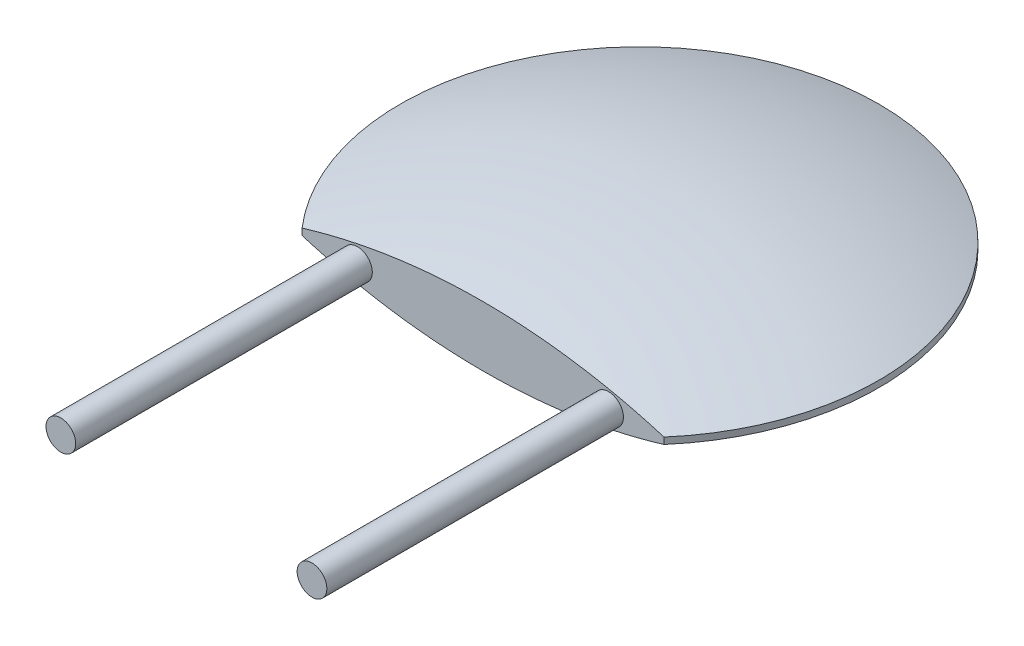
ISO-10303-21;
HEADER;
FILE_DESCRIPTION(('STEP AP214'),'2;1');
FILE_NAME('part.step','',(''),(''),'','','');
FILE_SCHEMA(('AUTOMOTIVE_DESIGN { 1 0 10303 214 1 1 1 1 }'));
ENDSEC;
DATA;
#1=APPLICATION_CONTEXT('core data for automotive mechanical design processes');
#2=APPLICATION_PROTOCOL_DEFINITION('international standard','automotive_design',2000,#1);
#3=PRODUCT_CONTEXT('',#1,'mechanical');
#4=PRODUCT('Part','Part','',(#3));
#5=PRODUCT_RELATED_PRODUCT_CATEGORY('part','',(#4));
#6=PRODUCT_DEFINITION_FORMATION('','',#4);
#7=PRODUCT_DEFINITION_CONTEXT('part definition',#1,'design');
#8=PRODUCT_DEFINITION('design','',#6,#7);
#9=PRODUCT_DEFINITION_SHAPE('','',#8);
#10=(LENGTH_UNIT() NAMED_UNIT(*) SI_UNIT(.MILLI.,.METRE.));
#11=(NAMED_UNIT(*) PLANE_ANGLE_UNIT() SI_UNIT($,.RADIAN.));
#12=(NAMED_UNIT(*) SI_UNIT($,.STERADIAN.) SOLID_ANGLE_UNIT());
#13=UNCERTAINTY_MEASURE_WITH_UNIT(LENGTH_MEASURE(1.E-05),#10,'distance_accuracy_value','');
#14=(GEOMETRIC_REPRESENTATION_CONTEXT(3) GLOBAL_UNCERTAINTY_ASSIGNED_CONTEXT((#13)) GLOBAL_UNIT_ASSIGNED_CONTEXT((#10,
#11,#12)) REPRESENTATION_CONTEXT('',''));
#15=CARTESIAN_POINT('',(0.,0.,0.));
#16=DIRECTION('',(0.,0.,1.));
#17=DIRECTION('',(1.,0.,0.));
#18=AXIS2_PLACEMENT_3D('',#15,#16,#17);
#19=CARTESIAN_POINT('',(-2.81546097253104,-5.,1.58339599993626));
#20=DIRECTION('',(0.,0.,-1.));
#21=DIRECTION('',(-1.,0.,0.));
#22=AXIS2_PLACEMENT_3D('',#19,#20,#21);
#23=PLANE('',#22);
#24=CARTESIAN_POINT('',(-1.27000000000261,0.,1.58339599993626));
#25=DIRECTION('',(0.,0.,-1.));
#26=DIRECTION('',(-1.,0.,0.));
#27=AXIS2_PLACEMENT_3D('',#24,#25,#26);
#28=CIRCLE('',#27,0.15);
#29=CARTESIAN_POINT('',(-1.42000000000261,0.,1.58339599993626));
#30=VERTEX_POINT('',#29);
#31=EDGE_CURVE('E48',#30,#30,#28,.F.);
#32=ORIENTED_EDGE('',*,*,#31,.F.);
#33=EDGE_LOOP('',(#32));
#34=FACE_BOUND('',#33,.T.);
#35=CARTESIAN_POINT('',(0.,-6.,1.58339599993626));
#36=DIRECTION('',(0.,0.,-1.));
#37=DIRECTION('',(-1.,0.,0.));
#38=AXIS2_PLACEMENT_3D('',#35,#36,#37);
#39=CIRCLE('',#38,6.3041936127776);
#40=CARTESIAN_POINT('',(1.83027611738044,0.0326566653110483,1.58339599993975));
#41=VERTEX_POINT('',#40);
#42=CARTESIAN_POINT('',(-1.83027611738044,0.0326566653110483,1.58339599993975));
#43=VERTEX_POINT('',#42);
#44=EDGE_CURVE('E79',#41,#43,#39,.F.);
#45=ORIENTED_EDGE('',*,*,#44,.T.);
#46=DIRECTION('',(0.,-1.,0.));
#47=VECTOR('',#46,1.);
#48=CARTESIAN_POINT('',(-1.83027611738044,-1000.,1.58339599993626));
#49=LINE('',#48,#47);
#50=CARTESIAN_POINT('',(-1.83027611738342,-0.0326566653110541,1.58339599993626));
#51=VERTEX_POINT('',#50);
#52=EDGE_CURVE('E55',#43,#51,#49,.T.);
#53=ORIENTED_EDGE('',*,*,#52,.T.);
#54=CARTESIAN_POINT('',(0.,6.,1.58339599993626));
#55=DIRECTION('',(0.,0.,-1.));
#56=DIRECTION('',(-1.,0.,0.));
#57=AXIS2_PLACEMENT_3D('',#54,#55,#56);
#58=CIRCLE('',#57,6.3041936127776);
#59=CARTESIAN_POINT('',(1.83027611738342,-0.0326566653110541,1.58339599993626));
#60=VERTEX_POINT('',#59);
#61=EDGE_CURVE('E65',#51,#60,#58,.F.);
#62=ORIENTED_EDGE('',*,*,#61,.T.);
#63=DIRECTION('',(0.,-1.,0.));
#64=VECTOR('',#63,1.);
#65=CARTESIAN_POINT('',(1.83027611738044,-1000.,1.58339599993626));
#66=LINE('',#65,#64);
#67=EDGE_CURVE('E60',#60,#41,#66,.F.);
#68=ORIENTED_EDGE('',*,*,#67,.T.);
#69=EDGE_LOOP('',(#45,#53,#62,#68));
#70=FACE_BOUND('',#69,.T.);
#71=CARTESIAN_POINT('',(1.27000000000261,0.,1.58339599993626));
#72=DIRECTION('',(0.,0.,-1.));
#73=DIRECTION('',(-1.,0.,0.));
#74=AXIS2_PLACEMENT_3D('',#71,#72,#73);
#75=CIRCLE('',#74,0.15);
#76=CARTESIAN_POINT('',(1.12000000000261,0.,1.58339599993626));
#77=VERTEX_POINT('',#76);
#78=EDGE_CURVE('E11',#77,#77,#75,.F.);
#79=ORIENTED_EDGE('',*,*,#78,.F.);
#80=EDGE_LOOP('',(#79));
#81=FACE_BOUND('',#80,.T.);
#82=ADVANCED_FACE('F39',(#34,#70,#81),#23,.F.);
#83=CARTESIAN_POINT('',(0.,-6.,0.));
#84=DIRECTION('',(0.,-1.,0.));
#85=DIRECTION('',(0.,0.,-1.));
#86=AXIS2_PLACEMENT_3D('',#83,#84,#85);
#87=SPHERICAL_SURFACE('',#86,6.5);
#88=ORIENTED_EDGE('',*,*,#44,.F.);
#89=CARTESIAN_POINT('',(0.,0.0326566653110483,0.));
#90=DIRECTION('',(0.,-1.,0.));
#91=DIRECTION('',(0.,0.,-1.));
#92=AXIS2_PLACEMENT_3D('',#89,#90,#91);
#93=CIRCLE('',#92,2.42013502897636);
#94=EDGE_CURVE('E71',#43,#41,#93,.T.);
#95=ORIENTED_EDGE('',*,*,#94,.F.);
#96=EDGE_LOOP('',(#88,#95));
#97=FACE_BOUND('',#96,.T.);
#98=ADVANCED_FACE('F41',(#97),#87,.T.);
#99=CARTESIAN_POINT('',(0.,-1000.,-3.49148336110938E-12));
#100=DIRECTION('',(0.,-1.,0.));
#101=DIRECTION('',(0.,0.,-1.));
#102=AXIS2_PLACEMENT_3D('',#99,#100,#101);
#103=CYLINDRICAL_SURFACE('',#102,2.42013502897636);
#104=ORIENTED_EDGE('',*,*,#67,.F.);
#105=CARTESIAN_POINT('',(0.,-0.0326566653110483,0.));
#106=DIRECTION('',(0.,-1.,0.));
#107=DIRECTION('',(0.,0.,-1.));
#108=AXIS2_PLACEMENT_3D('',#105,#106,#107);
#109=CIRCLE('',#108,2.42013502897636);
#110=EDGE_CURVE('E76',#51,#60,#109,.T.);
#111=ORIENTED_EDGE('',*,*,#110,.F.);
#112=ORIENTED_EDGE('',*,*,#52,.F.);
#113=ORIENTED_EDGE('',*,*,#94,.T.);
#114=EDGE_LOOP('',(#104,#111,#112,#113));
#115=FACE_BOUND('',#114,.T.);
#116=ADVANCED_FACE('F75',(#115),#103,.T.);
#117=CARTESIAN_POINT('',(0.,6.,0.));
#118=DIRECTION('',(0.,-1.,0.));
#119=DIRECTION('',(0.,0.,1.));
#120=AXIS2_PLACEMENT_3D('',#117,#118,#119);
#121=SPHERICAL_SURFACE('',#120,6.5);
#122=ORIENTED_EDGE('',*,*,#61,.F.);
#123=ORIENTED_EDGE('',*,*,#110,.T.);
#124=EDGE_LOOP('',(#122,#123));
#125=FACE_BOUND('',#124,.T.);
#126=ADVANCED_FACE('F81',(#125),#121,.T.);
#127=CARTESIAN_POINT('',(-1.27000000000261,0.,4.58339599993626));
#128=DIRECTION('',(0.,0.,-1.));
#129=DIRECTION('',(-1.,0.,0.));
#130=AXIS2_PLACEMENT_3D('',#127,#128,#129);
#131=CYLINDRICAL_SURFACE('',#130,0.15);
#132=CARTESIAN_POINT('',(-1.27000000000261,0.,4.58339599993626));
#133=DIRECTION('',(0.,0.,1.));
#134=DIRECTION('',(1.,0.,0.));
#135=AXIS2_PLACEMENT_3D('',#132,#133,#134);
#136=CIRCLE('',#135,0.15);
#137=CARTESIAN_POINT('',(-1.12000000000261,0.,4.58339599993626));
#138=VERTEX_POINT('',#137);
#139=EDGE_CURVE('E176',#138,#138,#136,.T.);
#140=ORIENTED_EDGE('',*,*,#139,.F.);
#141=EDGE_LOOP('',(#140));
#142=FACE_BOUND('',#141,.T.);
#143=ORIENTED_EDGE('',*,*,#31,.T.);
#144=EDGE_LOOP('',(#143));
#145=FACE_BOUND('',#144,.T.);
#146=ADVANCED_FACE('F92',(#142,#145),#131,.T.);
#147=CARTESIAN_POINT('',(-1.27000000000261,0.,4.58339599993626));
#148=DIRECTION('',(0.,0.,1.));
#149=DIRECTION('',(1.,0.,0.));
#150=AXIS2_PLACEMENT_3D('',#147,#148,#149);
#151=PLANE('',#150);
#152=ORIENTED_EDGE('',*,*,#139,.T.);
#153=EDGE_LOOP('',(#152));
#154=FACE_BOUND('',#153,.T.);
#155=ADVANCED_FACE('F117',(#154),#151,.T.);
#156=CARTESIAN_POINT('',(1.27000000000261,0.,4.58339599993626));
#157=DIRECTION('',(0.,0.,-1.));
#158=DIRECTION('',(-1.,0.,0.));
#159=AXIS2_PLACEMENT_3D('',#156,#157,#158);
#160=CYLINDRICAL_SURFACE('',#159,0.15);
#161=CARTESIAN_POINT('',(1.27000000000261,0.,4.58339599993626));
#162=DIRECTION('',(0.,0.,1.));
#163=DIRECTION('',(-1.,0.,0.));
#164=AXIS2_PLACEMENT_3D('',#161,#162,#163);
#165=CIRCLE('',#164,0.15);
#166=CARTESIAN_POINT('',(1.12000000000261,0.,4.58339599993626));
#167=VERTEX_POINT('',#166);
#168=EDGE_CURVE('E174',#167,#167,#165,.T.);
#169=ORIENTED_EDGE('',*,*,#168,.F.);
#170=EDGE_LOOP('',(#169));
#171=FACE_BOUND('',#170,.T.);
#172=ORIENTED_EDGE('',*,*,#78,.T.);
#173=EDGE_LOOP('',(#172));
#174=FACE_BOUND('',#173,.T.);
#175=ADVANCED_FACE('F123',(#171,#174),#160,.T.);
#176=CARTESIAN_POINT('',(1.27000000000261,0.,4.58339599993626));
#177=DIRECTION('',(0.,0.,-1.));
#178=DIRECTION('',(-1.,0.,0.));
#179=AXIS2_PLACEMENT_3D('',#176,#177,#178);
#180=PLANE('',#179);
#181=ORIENTED_EDGE('',*,*,#168,.T.);
#182=EDGE_LOOP('',(#181));
#183=FACE_BOUND('',#182,.T.);
#184=ADVANCED_FACE('F129',(#183),#180,.F.);
#185=CLOSED_SHELL('',(#82,#98,#116,#126,#146,#155,#175,#184));
#186=MANIFOLD_SOLID_BREP('B2',#185);
#187=ADVANCED_BREP_SHAPE_REPRESENTATION('',(#18,#186),#14);
#188=SHAPE_DEFINITION_REPRESENTATION(#9,#187);
ENDSEC;
END-ISO-10303-21;
